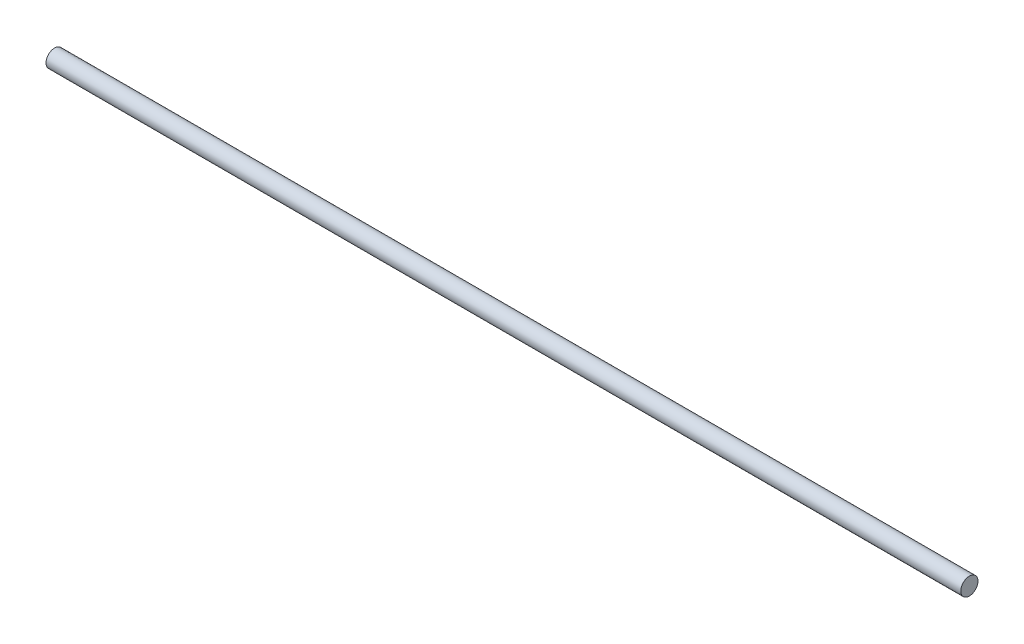
ISO-10303-21;
HEADER;
FILE_DESCRIPTION(('STEP AP214'),'2;1');
FILE_NAME('part.step','',(''),(''),'','','');
FILE_SCHEMA(('AUTOMOTIVE_DESIGN { 1 0 10303 214 1 1 1 1 }'));
ENDSEC;
DATA;
#1=APPLICATION_CONTEXT('core data for automotive mechanical design processes');
#2=APPLICATION_PROTOCOL_DEFINITION('international standard','automotive_design',2000,#1);
#3=PRODUCT_CONTEXT('',#1,'mechanical');
#4=PRODUCT('Part','Part','',(#3));
#5=PRODUCT_RELATED_PRODUCT_CATEGORY('part','',(#4));
#6=PRODUCT_DEFINITION_FORMATION('','',#4);
#7=PRODUCT_DEFINITION_CONTEXT('part definition',#1,'design');
#8=PRODUCT_DEFINITION('design','',#6,#7);
#9=PRODUCT_DEFINITION_SHAPE('','',#8);
#10=(LENGTH_UNIT() NAMED_UNIT(*) SI_UNIT(.MILLI.,.METRE.));
#11=(NAMED_UNIT(*) PLANE_ANGLE_UNIT() SI_UNIT($,.RADIAN.));
#12=(NAMED_UNIT(*) SI_UNIT($,.STERADIAN.) SOLID_ANGLE_UNIT());
#13=UNCERTAINTY_MEASURE_WITH_UNIT(LENGTH_MEASURE(1.E-05),#10,'distance_accuracy_value','');
#14=(GEOMETRIC_REPRESENTATION_CONTEXT(3) GLOBAL_UNCERTAINTY_ASSIGNED_CONTEXT((#13)) GLOBAL_UNIT_ASSIGNED_CONTEXT((#10,
#11,#12)) REPRESENTATION_CONTEXT('',''));
#15=CARTESIAN_POINT('',(0.,0.,0.));
#16=DIRECTION('',(0.,0.,1.));
#17=DIRECTION('',(1.,0.,0.));
#18=AXIS2_PLACEMENT_3D('',#15,#16,#17);
#19=CARTESIAN_POINT('',(265.,0.,0.));
#20=DIRECTION('',(-1.,0.,0.));
#21=DIRECTION('',(0.,0.,1.));
#22=AXIS2_PLACEMENT_3D('',#19,#20,#21);
#23=CYLINDRICAL_SURFACE('',#22,2.5);
#24=CARTESIAN_POINT('',(265.,0.,0.));
#25=DIRECTION('',(1.,0.,0.));
#26=DIRECTION('',(0.,0.,-1.));
#27=AXIS2_PLACEMENT_3D('',#24,#25,#26);
#28=CIRCLE('',#27,2.5);
#29=CARTESIAN_POINT('',(265.,0.,-2.5));
#30=VERTEX_POINT('',#29);
#31=EDGE_CURVE('E10',#30,#30,#28,.T.);
#32=ORIENTED_EDGE('',*,*,#31,.F.);
#33=EDGE_LOOP('',(#32));
#34=FACE_BOUND('',#33,.T.);
#35=CARTESIAN_POINT('',(0.,0.,0.));
#36=DIRECTION('',(1.,0.,0.));
#37=DIRECTION('',(0.,0.,-1.));
#38=AXIS2_PLACEMENT_3D('',#35,#36,#37);
#39=CIRCLE('',#38,2.5);
#40=CARTESIAN_POINT('',(0.,0.,-2.5));
#41=VERTEX_POINT('',#40);
#42=EDGE_CURVE('E35',#41,#41,#39,.T.);
#43=ORIENTED_EDGE('',*,*,#42,.T.);
#44=EDGE_LOOP('',(#43));
#45=FACE_BOUND('',#44,.T.);
#46=ADVANCED_FACE('F32',(#34,#45),#23,.T.);
#47=CARTESIAN_POINT('',(265.,0.,0.));
#48=DIRECTION('',(1.,0.,0.));
#49=DIRECTION('',(0.,0.,-1.));
#50=AXIS2_PLACEMENT_3D('',#47,#48,#49);
#51=PLANE('',#50);
#52=ORIENTED_EDGE('',*,*,#31,.T.);
#53=EDGE_LOOP('',(#52));
#54=FACE_BOUND('',#53,.T.);
#55=ADVANCED_FACE('F47',(#54),#51,.T.);
#56=CARTESIAN_POINT('',(0.,0.,0.));
#57=DIRECTION('',(1.,0.,0.));
#58=DIRECTION('',(0.,0.,-1.));
#59=AXIS2_PLACEMENT_3D('',#56,#57,#58);
#60=PLANE('',#59);
#61=ORIENTED_EDGE('',*,*,#42,.F.);
#62=EDGE_LOOP('',(#61));
#63=FACE_BOUND('',#62,.T.);
#64=ADVANCED_FACE('F45',(#63),#60,.F.);
#65=CLOSED_SHELL('',(#46,#55,#64));
#66=MANIFOLD_SOLID_BREP('B2',#65);
#67=ADVANCED_BREP_SHAPE_REPRESENTATION('',(#18,#66),#14);
#68=SHAPE_DEFINITION_REPRESENTATION(#9,#67);
ENDSEC;
END-ISO-10303-21;
